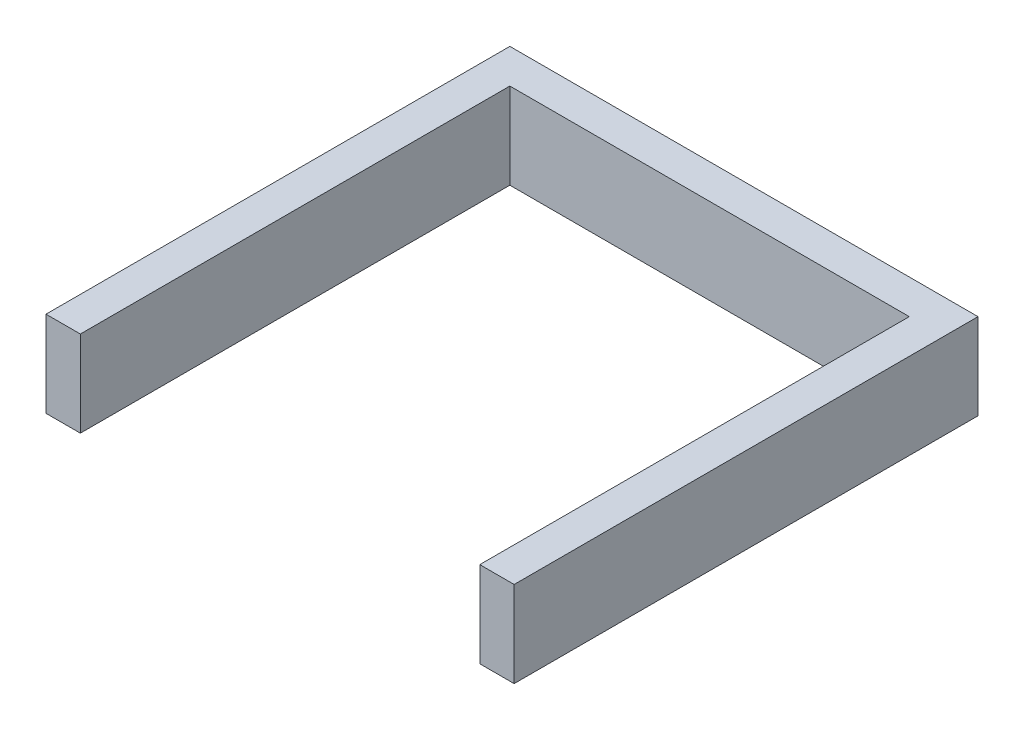
ISO-10303-21;
HEADER;
FILE_DESCRIPTION(('STEP AP214'),'2;1');
FILE_NAME('part.step','',(''),(''),'','','');
FILE_SCHEMA(('AUTOMOTIVE_DESIGN { 1 0 10303 214 1 1 1 1 }'));
ENDSEC;
DATA;
#1=APPLICATION_CONTEXT('core data for automotive mechanical design processes');
#2=APPLICATION_PROTOCOL_DEFINITION('international standard','automotive_design',2000,#1);
#3=PRODUCT_CONTEXT('',#1,'mechanical');
#4=PRODUCT('Part','Part','',(#3));
#5=PRODUCT_RELATED_PRODUCT_CATEGORY('part','',(#4));
#6=PRODUCT_DEFINITION_FORMATION('','',#4);
#7=PRODUCT_DEFINITION_CONTEXT('part definition',#1,'design');
#8=PRODUCT_DEFINITION('design','',#6,#7);
#9=PRODUCT_DEFINITION_SHAPE('','',#8);
#10=(LENGTH_UNIT() NAMED_UNIT(*) SI_UNIT(.MILLI.,.METRE.));
#11=(NAMED_UNIT(*) PLANE_ANGLE_UNIT() SI_UNIT($,.RADIAN.));
#12=(NAMED_UNIT(*) SI_UNIT($,.STERADIAN.) SOLID_ANGLE_UNIT());
#13=UNCERTAINTY_MEASURE_WITH_UNIT(LENGTH_MEASURE(1.E-05),#10,'distance_accuracy_value','');
#14=(GEOMETRIC_REPRESENTATION_CONTEXT(3) GLOBAL_UNCERTAINTY_ASSIGNED_CONTEXT((#13)) GLOBAL_UNIT_ASSIGNED_CONTEXT((#10,
#11,#12)) REPRESENTATION_CONTEXT('',''));
#15=CARTESIAN_POINT('',(0.,0.,0.));
#16=DIRECTION('',(0.,0.,1.));
#17=DIRECTION('',(1.,0.,0.));
#18=AXIS2_PLACEMENT_3D('',#15,#16,#17);
#19=CARTESIAN_POINT('',(-2.,5.,0.));
#20=DIRECTION('',(0.,0.,-1.));
#21=DIRECTION('',(-1.,0.,0.));
#22=AXIS2_PLACEMENT_3D('',#19,#20,#21);
#23=PLANE('',#22);
#24=DIRECTION('',(1.,0.,0.));
#25=VECTOR('',#24,1.);
#26=CARTESIAN_POINT('',(-2.,0.,0.));
#27=LINE('',#26,#25);
#28=CARTESIAN_POINT('',(-2.,0.,0.));
#29=VERTEX_POINT('',#28);
#30=CARTESIAN_POINT('',(0.,0.,0.));
#31=VERTEX_POINT('',#30);
#32=EDGE_CURVE('E135',#29,#31,#27,.T.);
#33=ORIENTED_EDGE('',*,*,#32,.T.);
#34=DIRECTION('',(0.,-1.,0.));
#35=VECTOR('',#34,1.);
#36=CARTESIAN_POINT('',(0.,5.,0.));
#37=LINE('',#36,#35);
#38=CARTESIAN_POINT('',(0.,5.,0.));
#39=VERTEX_POINT('',#38);
#40=EDGE_CURVE('E11',#39,#31,#37,.T.);
#41=ORIENTED_EDGE('',*,*,#40,.F.);
#42=DIRECTION('',(1.,0.,0.));
#43=VECTOR('',#42,1.);
#44=CARTESIAN_POINT('',(-2.,5.,0.));
#45=LINE('',#44,#43);
#46=CARTESIAN_POINT('',(-2.,5.,0.));
#47=VERTEX_POINT('',#46);
#48=EDGE_CURVE('E149',#47,#39,#45,.T.);
#49=ORIENTED_EDGE('',*,*,#48,.F.);
#50=DIRECTION('',(0.,-1.,0.));
#51=VECTOR('',#50,1.);
#52=CARTESIAN_POINT('',(-2.,5.,0.));
#53=LINE('',#52,#51);
#54=EDGE_CURVE('E131',#47,#29,#53,.T.);
#55=ORIENTED_EDGE('',*,*,#54,.T.);
#56=EDGE_LOOP('',(#33,#41,#49,#55));
#57=FACE_BOUND('',#56,.T.);
#58=ADVANCED_FACE('F39',(#57),#23,.F.);
#59=CARTESIAN_POINT('',(0.,5.,0.));
#60=DIRECTION('',(-1.,0.,0.));
#61=DIRECTION('',(0.,0.,1.));
#62=AXIS2_PLACEMENT_3D('',#59,#60,#61);
#63=PLANE('',#62);
#64=DIRECTION('',(0.,0.,-1.));
#65=VECTOR('',#64,1.);
#66=CARTESIAN_POINT('',(0.,0.,0.));
#67=LINE('',#66,#65);
#68=CARTESIAN_POINT('',(0.,0.,-25.));
#69=VERTEX_POINT('',#68);
#70=EDGE_CURVE('E138',#31,#69,#67,.T.);
#71=ORIENTED_EDGE('',*,*,#70,.T.);
#72=DIRECTION('',(0.,-1.,0.));
#73=VECTOR('',#72,1.);
#74=CARTESIAN_POINT('',(0.,5.,-25.));
#75=LINE('',#74,#73);
#76=CARTESIAN_POINT('',(0.,5.,-25.));
#77=VERTEX_POINT('',#76);
#78=EDGE_CURVE('E47',#77,#69,#75,.T.);
#79=ORIENTED_EDGE('',*,*,#78,.F.);
#80=DIRECTION('',(0.,0.,-1.));
#81=VECTOR('',#80,1.);
#82=CARTESIAN_POINT('',(0.,5.,0.));
#83=LINE('',#82,#81);
#84=EDGE_CURVE('E98',#39,#77,#83,.T.);
#85=ORIENTED_EDGE('',*,*,#84,.F.);
#86=ORIENTED_EDGE('',*,*,#40,.T.);
#87=EDGE_LOOP('',(#71,#79,#85,#86));
#88=FACE_BOUND('',#87,.T.);
#89=ADVANCED_FACE('F184',(#88),#63,.F.);
#90=CARTESIAN_POINT('',(0.,5.,-25.));
#91=DIRECTION('',(0.,0.,-1.));
#92=DIRECTION('',(-1.,0.,0.));
#93=AXIS2_PLACEMENT_3D('',#90,#91,#92);
#94=PLANE('',#93);
#95=DIRECTION('',(1.,0.,0.));
#96=VECTOR('',#95,1.);
#97=CARTESIAN_POINT('',(0.,0.,-25.));
#98=LINE('',#97,#96);
#99=CARTESIAN_POINT('',(23.25,0.,-25.));
#100=VERTEX_POINT('',#99);
#101=EDGE_CURVE('E140',#69,#100,#98,.T.);
#102=ORIENTED_EDGE('',*,*,#101,.T.);
#103=DIRECTION('',(0.,-1.,0.));
#104=VECTOR('',#103,1.);
#105=CARTESIAN_POINT('',(23.25,5.,-25.));
#106=LINE('',#105,#104);
#107=CARTESIAN_POINT('',(23.25,5.,-25.));
#108=VERTEX_POINT('',#107);
#109=EDGE_CURVE('E156',#108,#100,#106,.T.);
#110=ORIENTED_EDGE('',*,*,#109,.F.);
#111=DIRECTION('',(1.,0.,0.));
#112=VECTOR('',#111,1.);
#113=CARTESIAN_POINT('',(0.,5.,-25.));
#114=LINE('',#113,#112);
#115=EDGE_CURVE('E164',#77,#108,#114,.T.);
#116=ORIENTED_EDGE('',*,*,#115,.F.);
#117=ORIENTED_EDGE('',*,*,#78,.T.);
#118=EDGE_LOOP('',(#102,#110,#116,#117));
#119=FACE_BOUND('',#118,.T.);
#120=ADVANCED_FACE('F162',(#119),#94,.F.);
#121=CARTESIAN_POINT('',(23.25,5.,0.));
#122=DIRECTION('',(1.,0.,0.));
#123=DIRECTION('',(0.,0.,-1.));
#124=AXIS2_PLACEMENT_3D('',#121,#122,#123);
#125=PLANE('',#124);
#126=DIRECTION('',(0.,0.,1.));
#127=VECTOR('',#126,1.);
#128=CARTESIAN_POINT('',(23.25,0.,0.));
#129=LINE('',#128,#127);
#130=CARTESIAN_POINT('',(23.25,0.,0.));
#131=VERTEX_POINT('',#130);
#132=EDGE_CURVE('E142',#100,#131,#129,.T.);
#133=ORIENTED_EDGE('',*,*,#132,.T.);
#134=DIRECTION('',(0.,-1.,0.));
#135=VECTOR('',#134,1.);
#136=CARTESIAN_POINT('',(23.25,5.,0.));
#137=LINE('',#136,#135);
#138=CARTESIAN_POINT('',(23.25,5.,0.));
#139=VERTEX_POINT('',#138);
#140=EDGE_CURVE('E153',#139,#131,#137,.T.);
#141=ORIENTED_EDGE('',*,*,#140,.F.);
#142=DIRECTION('',(0.,0.,1.));
#143=VECTOR('',#142,1.);
#144=CARTESIAN_POINT('',(23.25,5.,0.));
#145=LINE('',#144,#143);
#146=EDGE_CURVE('E176',#108,#139,#145,.T.);
#147=ORIENTED_EDGE('',*,*,#146,.F.);
#148=ORIENTED_EDGE('',*,*,#109,.T.);
#149=EDGE_LOOP('',(#133,#141,#147,#148));
#150=FACE_BOUND('',#149,.T.);
#151=ADVANCED_FACE('F172',(#150),#125,.F.);
#152=CARTESIAN_POINT('',(23.25,5.,0.));
#153=DIRECTION('',(0.,0.,-1.));
#154=DIRECTION('',(-1.,0.,0.));
#155=AXIS2_PLACEMENT_3D('',#152,#153,#154);
#156=PLANE('',#155);
#157=DIRECTION('',(1.,0.,0.));
#158=VECTOR('',#157,1.);
#159=CARTESIAN_POINT('',(23.25,0.,0.));
#160=LINE('',#159,#158);
#161=CARTESIAN_POINT('',(25.25,0.,0.));
#162=VERTEX_POINT('',#161);
#163=EDGE_CURVE('E144',#131,#162,#160,.T.);
#164=ORIENTED_EDGE('',*,*,#163,.T.);
#165=DIRECTION('',(0.,-1.,0.));
#166=VECTOR('',#165,1.);
#167=CARTESIAN_POINT('',(25.25,5.,0.));
#168=LINE('',#167,#166);
#169=CARTESIAN_POINT('',(25.25,5.,0.));
#170=VERTEX_POINT('',#169);
#171=EDGE_CURVE('E126',#170,#162,#168,.T.);
#172=ORIENTED_EDGE('',*,*,#171,.F.);
#173=DIRECTION('',(1.,0.,0.));
#174=VECTOR('',#173,1.);
#175=CARTESIAN_POINT('',(23.25,5.,0.));
#176=LINE('',#175,#174);
#177=EDGE_CURVE('E117',#139,#170,#176,.T.);
#178=ORIENTED_EDGE('',*,*,#177,.F.);
#179=ORIENTED_EDGE('',*,*,#140,.T.);
#180=EDGE_LOOP('',(#164,#172,#178,#179));
#181=FACE_BOUND('',#180,.T.);
#182=ADVANCED_FACE('F175',(#181),#156,.F.);
#183=CARTESIAN_POINT('',(25.25,5.,0.));
#184=DIRECTION('',(-1.,0.,0.));
#185=DIRECTION('',(0.,0.,1.));
#186=AXIS2_PLACEMENT_3D('',#183,#184,#185);
#187=PLANE('',#186);
#188=DIRECTION('',(0.,0.,-1.));
#189=VECTOR('',#188,1.);
#190=CARTESIAN_POINT('',(25.25,0.,0.));
#191=LINE('',#190,#189);
#192=CARTESIAN_POINT('',(25.25,0.,-27.));
#193=VERTEX_POINT('',#192);
#194=EDGE_CURVE('E125',#162,#193,#191,.T.);
#195=ORIENTED_EDGE('',*,*,#194,.T.);
#196=DIRECTION('',(0.,-1.,0.));
#197=VECTOR('',#196,1.);
#198=CARTESIAN_POINT('',(25.25,5.,-27.));
#199=LINE('',#198,#197);
#200=CARTESIAN_POINT('',(25.25,5.,-27.));
#201=VERTEX_POINT('',#200);
#202=EDGE_CURVE('E122',#201,#193,#199,.T.);
#203=ORIENTED_EDGE('',*,*,#202,.F.);
#204=DIRECTION('',(0.,0.,-1.));
#205=VECTOR('',#204,1.);
#206=CARTESIAN_POINT('',(25.25,5.,0.));
#207=LINE('',#206,#205);
#208=EDGE_CURVE('E111',#170,#201,#207,.T.);
#209=ORIENTED_EDGE('',*,*,#208,.F.);
#210=ORIENTED_EDGE('',*,*,#171,.T.);
#211=EDGE_LOOP('',(#195,#203,#209,#210));
#212=FACE_BOUND('',#211,.T.);
#213=ADVANCED_FACE('F123',(#212),#187,.F.);
#214=CARTESIAN_POINT('',(-2.,5.,-27.));
#215=DIRECTION('',(0.,0.,1.));
#216=DIRECTION('',(1.,0.,0.));
#217=AXIS2_PLACEMENT_3D('',#214,#215,#216);
#218=PLANE('',#217);
#219=DIRECTION('',(-1.,0.,0.));
#220=VECTOR('',#219,1.);
#221=CARTESIAN_POINT('',(-2.,0.,-27.));
#222=LINE('',#221,#220);
#223=CARTESIAN_POINT('',(-2.,0.,-27.));
#224=VERTEX_POINT('',#223);
#225=EDGE_CURVE('E84',#193,#224,#222,.T.);
#226=ORIENTED_EDGE('',*,*,#225,.T.);
#227=DIRECTION('',(0.,-1.,0.));
#228=VECTOR('',#227,1.);
#229=CARTESIAN_POINT('',(-2.,5.,-27.));
#230=LINE('',#229,#228);
#231=CARTESIAN_POINT('',(-2.,5.,-27.));
#232=VERTEX_POINT('',#231);
#233=EDGE_CURVE('E127',#232,#224,#230,.T.);
#234=ORIENTED_EDGE('',*,*,#233,.F.);
#235=DIRECTION('',(-1.,0.,0.));
#236=VECTOR('',#235,1.);
#237=CARTESIAN_POINT('',(-2.,5.,-27.));
#238=LINE('',#237,#236);
#239=EDGE_CURVE('E115',#201,#232,#238,.T.);
#240=ORIENTED_EDGE('',*,*,#239,.F.);
#241=ORIENTED_EDGE('',*,*,#202,.T.);
#242=EDGE_LOOP('',(#226,#234,#240,#241));
#243=FACE_BOUND('',#242,.T.);
#244=ADVANCED_FACE('F129',(#243),#218,.F.);
#245=CARTESIAN_POINT('',(-2.,5.,0.));
#246=DIRECTION('',(1.,0.,0.));
#247=DIRECTION('',(0.,0.,-1.));
#248=AXIS2_PLACEMENT_3D('',#245,#246,#247);
#249=PLANE('',#248);
#250=DIRECTION('',(0.,0.,1.));
#251=VECTOR('',#250,1.);
#252=CARTESIAN_POINT('',(-2.,0.,0.));
#253=LINE('',#252,#251);
#254=EDGE_CURVE('E90',#224,#29,#253,.T.);
#255=ORIENTED_EDGE('',*,*,#254,.T.);
#256=ORIENTED_EDGE('',*,*,#54,.F.);
#257=DIRECTION('',(0.,0.,1.));
#258=VECTOR('',#257,1.);
#259=CARTESIAN_POINT('',(-2.,5.,0.));
#260=LINE('',#259,#258);
#261=EDGE_CURVE('E55',#232,#47,#260,.T.);
#262=ORIENTED_EDGE('',*,*,#261,.F.);
#263=ORIENTED_EDGE('',*,*,#233,.T.);
#264=EDGE_LOOP('',(#255,#256,#262,#263));
#265=FACE_BOUND('',#264,.T.);
#266=ADVANCED_FACE('F200',(#265),#249,.F.);
#267=CARTESIAN_POINT('',(0.,5.,0.));
#268=DIRECTION('',(0.,1.,0.));
#269=DIRECTION('',(0.,0.,1.));
#270=AXIS2_PLACEMENT_3D('',#267,#268,#269);
#271=PLANE('',#270);
#272=ORIENTED_EDGE('',*,*,#48,.T.);
#273=ORIENTED_EDGE('',*,*,#84,.T.);
#274=ORIENTED_EDGE('',*,*,#115,.T.);
#275=ORIENTED_EDGE('',*,*,#146,.T.);
#276=ORIENTED_EDGE('',*,*,#177,.T.);
#277=ORIENTED_EDGE('',*,*,#208,.T.);
#278=ORIENTED_EDGE('',*,*,#239,.T.);
#279=ORIENTED_EDGE('',*,*,#261,.T.);
#280=EDGE_LOOP('',(#272,#273,#274,#275,#276,#277,#278,#279));
#281=FACE_BOUND('',#280,.T.);
#282=ADVANCED_FACE('F113',(#281),#271,.T.);
#283=CARTESIAN_POINT('',(0.,0.,0.));
#284=DIRECTION('',(0.,1.,0.));
#285=DIRECTION('',(0.,0.,1.));
#286=AXIS2_PLACEMENT_3D('',#283,#284,#285);
#287=PLANE('',#286);
#288=ORIENTED_EDGE('',*,*,#32,.F.);
#289=ORIENTED_EDGE('',*,*,#254,.F.);
#290=ORIENTED_EDGE('',*,*,#225,.F.);
#291=ORIENTED_EDGE('',*,*,#194,.F.);
#292=ORIENTED_EDGE('',*,*,#163,.F.);
#293=ORIENTED_EDGE('',*,*,#132,.F.);
#294=ORIENTED_EDGE('',*,*,#101,.F.);
#295=ORIENTED_EDGE('',*,*,#70,.F.);
#296=EDGE_LOOP('',(#288,#289,#290,#291,#292,#293,#294,#295));
#297=FACE_BOUND('',#296,.T.);
#298=ADVANCED_FACE('F168',(#297),#287,.F.);
#299=CLOSED_SHELL('',(#58,#89,#120,#151,#182,#213,#244,#266,#282,#298));
#300=MANIFOLD_SOLID_BREP('B2',#299);
#301=ADVANCED_BREP_SHAPE_REPRESENTATION('',(#18,#300),#14);
#302=SHAPE_DEFINITION_REPRESENTATION(#9,#301);
ENDSEC;
END-ISO-10303-21;
